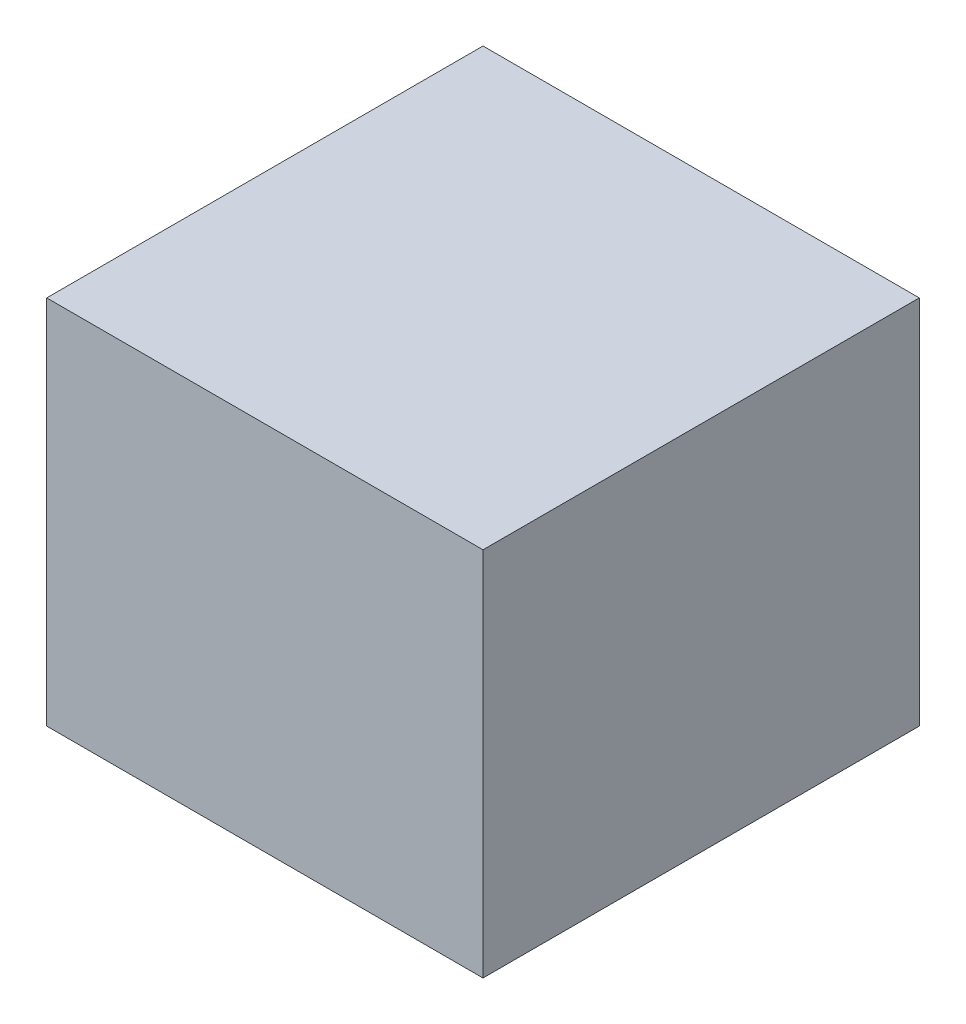
ISO-10303-21;
HEADER;
FILE_DESCRIPTION(('STEP AP214'),'2;1');
FILE_NAME('part.step','',(''),(''),'','','');
FILE_SCHEMA(('AUTOMOTIVE_DESIGN { 1 0 10303 214 1 1 1 1 }'));
ENDSEC;
DATA;
#1=APPLICATION_CONTEXT('core data for automotive mechanical design processes');
#2=APPLICATION_PROTOCOL_DEFINITION('international standard','automotive_design',2000,#1);
#3=PRODUCT_CONTEXT('',#1,'mechanical');
#4=PRODUCT('Part','Part','',(#3));
#5=PRODUCT_RELATED_PRODUCT_CATEGORY('part','',(#4));
#6=PRODUCT_DEFINITION_FORMATION('','',#4);
#7=PRODUCT_DEFINITION_CONTEXT('part definition',#1,'design');
#8=PRODUCT_DEFINITION('design','',#6,#7);
#9=PRODUCT_DEFINITION_SHAPE('','',#8);
#10=(LENGTH_UNIT() NAMED_UNIT(*) SI_UNIT(.MILLI.,.METRE.));
#11=(NAMED_UNIT(*) PLANE_ANGLE_UNIT() SI_UNIT($,.RADIAN.));
#12=(NAMED_UNIT(*) SI_UNIT($,.STERADIAN.) SOLID_ANGLE_UNIT());
#13=UNCERTAINTY_MEASURE_WITH_UNIT(LENGTH_MEASURE(1.E-05),#10,'distance_accuracy_value','');
#14=(GEOMETRIC_REPRESENTATION_CONTEXT(3) GLOBAL_UNCERTAINTY_ASSIGNED_CONTEXT((#13)) GLOBAL_UNIT_ASSIGNED_CONTEXT((#10,
#11,#12)) REPRESENTATION_CONTEXT('',''));
#15=CARTESIAN_POINT('',(0.,0.,0.));
#16=DIRECTION('',(0.,0.,1.));
#17=DIRECTION('',(1.,0.,0.));
#18=AXIS2_PLACEMENT_3D('',#15,#16,#17);
#19=CARTESIAN_POINT('',(0.,76.2,0.));
#20=DIRECTION('',(0.,1.,0.));
#21=DIRECTION('',(0.,0.,1.));
#22=AXIS2_PLACEMENT_3D('',#19,#20,#21);
#23=PLANE('',#22);
#24=CARTESIAN_POINT('',(0.,76.2,0.));
#25=DIRECTION('',(0.,1.,0.));
#26=DIRECTION('',(0.,0.,1.));
#27=AXIS2_PLACEMENT_3D('',#24,#25,#26);
#28=CIRCLE('',#27,10.16);
#29=CARTESIAN_POINT('',(0.,76.2,10.16));
#30=VERTEX_POINT('',#29);
#31=EDGE_CURVE('E176',#30,#30,#28,.T.);
#32=ORIENTED_EDGE('',*,*,#31,.F.);
#33=EDGE_LOOP('',(#32));
#34=FACE_BOUND('',#33,.T.);
#35=ADVANCED_FACE('F39',(#34),#23,.F.);
#36=CARTESIAN_POINT('',(13.208,86.36,0.));
#37=DIRECTION('',(0.,-1.,0.));
#38=DIRECTION('',(0.,0.,-1.));
#39=AXIS2_PLACEMENT_3D('',#36,#37,#38);
#40=PLANE('',#39);
#41=DIRECTION('',(0.,0.,-1.));
#42=VECTOR('',#41,1.);
#43=CARTESIAN_POINT('',(50.8,86.36,50.8));
#44=LINE('',#43,#42);
#45=CARTESIAN_POINT('',(50.8,86.36,50.8));
#46=VERTEX_POINT('',#45);
#47=CARTESIAN_POINT('',(50.8,86.36,-50.8));
#48=VERTEX_POINT('',#47);
#49=EDGE_CURVE('E47',#46,#48,#44,.T.);
#50=ORIENTED_EDGE('',*,*,#49,.T.);
#51=DIRECTION('',(-1.,0.,0.));
#52=VECTOR('',#51,1.);
#53=CARTESIAN_POINT('',(-50.8,86.36,-50.8));
#54=LINE('',#53,#52);
#55=CARTESIAN_POINT('',(-50.8,86.36,-50.8));
#56=VERTEX_POINT('',#55);
#57=EDGE_CURVE('E53',#48,#56,#54,.T.);
#58=ORIENTED_EDGE('',*,*,#57,.T.);
#59=DIRECTION('',(0.,0.,1.));
#60=VECTOR('',#59,1.);
#61=CARTESIAN_POINT('',(-50.8,86.36,50.8));
#62=LINE('',#61,#60);
#63=CARTESIAN_POINT('',(-50.8,86.36,50.8));
#64=VERTEX_POINT('',#63);
#65=EDGE_CURVE('E109',#56,#64,#62,.T.);
#66=ORIENTED_EDGE('',*,*,#65,.T.);
#67=DIRECTION('',(1.,0.,0.));
#68=VECTOR('',#67,1.);
#69=CARTESIAN_POINT('',(-50.8,86.36,50.8));
#70=LINE('',#69,#68);
#71=EDGE_CURVE('E11',#64,#46,#70,.T.);
#72=ORIENTED_EDGE('',*,*,#71,.T.);
#73=EDGE_LOOP('',(#50,#58,#66,#72));
#74=FACE_BOUND('',#73,.T.);
#75=ADVANCED_FACE('F187',(#74),#40,.F.);
#76=CARTESIAN_POINT('',(-50.8,240.204097937106,-50.8));
#77=DIRECTION('',(0.,0.,-1.));
#78=DIRECTION('',(-1.,0.,0.));
#79=AXIS2_PLACEMENT_3D('',#76,#77,#78);
#80=PLANE('',#79);
#81=ORIENTED_EDGE('',*,*,#57,.F.);
#82=DIRECTION('',(0.,-1.,0.));
#83=VECTOR('',#82,1.);
#84=CARTESIAN_POINT('',(50.8,240.204097937106,-50.8));
#85=LINE('',#84,#83);
#86=CARTESIAN_POINT('',(50.8,0.,-50.8));
#87=VERTEX_POINT('',#86);
#88=EDGE_CURVE('E107',#48,#87,#85,.T.);
#89=ORIENTED_EDGE('',*,*,#88,.T.);
#90=DIRECTION('',(1.,0.,0.));
#91=VECTOR('',#90,1.);
#92=CARTESIAN_POINT('',(-50.8,0.,-50.8));
#93=LINE('',#92,#91);
#94=CARTESIAN_POINT('',(-50.8,0.,-50.8));
#95=VERTEX_POINT('',#94);
#96=EDGE_CURVE('E85',#95,#87,#93,.T.);
#97=ORIENTED_EDGE('',*,*,#96,.F.);
#98=DIRECTION('',(0.,-1.,0.));
#99=VECTOR('',#98,1.);
#100=CARTESIAN_POINT('',(-50.8,240.204097937106,-50.8));
#101=LINE('',#100,#99);
#102=EDGE_CURVE('E110',#56,#95,#101,.T.);
#103=ORIENTED_EDGE('',*,*,#102,.F.);
#104=EDGE_LOOP('',(#81,#89,#97,#103));
#105=FACE_BOUND('',#104,.T.);
#106=ADVANCED_FACE('F116',(#105),#80,.T.);
#107=CARTESIAN_POINT('',(-50.8,240.204097937106,50.8));
#108=DIRECTION('',(-1.,0.,0.));
#109=DIRECTION('',(0.,0.,1.));
#110=AXIS2_PLACEMENT_3D('',#107,#108,#109);
#111=PLANE('',#110);
#112=ORIENTED_EDGE('',*,*,#65,.F.);
#113=ORIENTED_EDGE('',*,*,#102,.T.);
#114=DIRECTION('',(0.,0.,-1.));
#115=VECTOR('',#114,1.);
#116=CARTESIAN_POINT('',(-50.8,0.,50.8));
#117=LINE('',#116,#115);
#118=CARTESIAN_POINT('',(-50.8,0.,50.8));
#119=VERTEX_POINT('',#118);
#120=EDGE_CURVE('E93',#119,#95,#117,.T.);
#121=ORIENTED_EDGE('',*,*,#120,.F.);
#122=DIRECTION('',(0.,-1.,0.));
#123=VECTOR('',#122,1.);
#124=CARTESIAN_POINT('',(-50.8,240.204097937106,50.8));
#125=LINE('',#124,#123);
#126=EDGE_CURVE('E84',#64,#119,#125,.T.);
#127=ORIENTED_EDGE('',*,*,#126,.F.);
#128=EDGE_LOOP('',(#112,#113,#121,#127));
#129=FACE_BOUND('',#128,.T.);
#130=ADVANCED_FACE('F114',(#129),#111,.T.);
#131=CARTESIAN_POINT('',(-50.8,240.204097937106,50.8));
#132=DIRECTION('',(0.,0.,1.));
#133=DIRECTION('',(1.,0.,0.));
#134=AXIS2_PLACEMENT_3D('',#131,#132,#133);
#135=PLANE('',#134);
#136=ORIENTED_EDGE('',*,*,#71,.F.);
#137=ORIENTED_EDGE('',*,*,#126,.T.);
#138=DIRECTION('',(-1.,0.,0.));
#139=VECTOR('',#138,1.);
#140=CARTESIAN_POINT('',(-50.8,0.,50.8));
#141=LINE('',#140,#139);
#142=CARTESIAN_POINT('',(50.8,0.,50.8));
#143=VERTEX_POINT('',#142);
#144=EDGE_CURVE('E87',#143,#119,#141,.T.);
#145=ORIENTED_EDGE('',*,*,#144,.F.);
#146=DIRECTION('',(0.,-1.,0.));
#147=VECTOR('',#146,1.);
#148=CARTESIAN_POINT('',(50.8,240.204097937106,50.8));
#149=LINE('',#148,#147);
#150=EDGE_CURVE('E75',#46,#143,#149,.T.);
#151=ORIENTED_EDGE('',*,*,#150,.F.);
#152=EDGE_LOOP('',(#136,#137,#145,#151));
#153=FACE_BOUND('',#152,.T.);
#154=ADVANCED_FACE('F88',(#153),#135,.T.);
#155=CARTESIAN_POINT('',(50.8,240.204097937106,50.8));
#156=DIRECTION('',(1.,0.,0.));
#157=DIRECTION('',(0.,0.,-1.));
#158=AXIS2_PLACEMENT_3D('',#155,#156,#157);
#159=PLANE('',#158);
#160=ORIENTED_EDGE('',*,*,#49,.F.);
#161=ORIENTED_EDGE('',*,*,#150,.T.);
#162=DIRECTION('',(0.,0.,1.));
#163=VECTOR('',#162,1.);
#164=CARTESIAN_POINT('',(50.8,0.,50.8));
#165=LINE('',#164,#163);
#166=EDGE_CURVE('E80',#87,#143,#165,.T.);
#167=ORIENTED_EDGE('',*,*,#166,.F.);
#168=ORIENTED_EDGE('',*,*,#88,.F.);
#169=EDGE_LOOP('',(#160,#161,#167,#168));
#170=FACE_BOUND('',#169,.T.);
#171=ADVANCED_FACE('F77',(#170),#159,.T.);
#172=CARTESIAN_POINT('',(0.,0.,0.));
#173=DIRECTION('',(0.,-1.,0.));
#174=DIRECTION('',(0.,0.,-1.));
#175=AXIS2_PLACEMENT_3D('',#172,#173,#174);
#176=PLANE('',#175);
#177=CARTESIAN_POINT('',(0.,0.,0.));
#178=DIRECTION('',(0.,1.,0.));
#179=DIRECTION('',(0.,0.,1.));
#180=AXIS2_PLACEMENT_3D('',#177,#178,#179);
#181=CIRCLE('',#180,35.56);
#182=CARTESIAN_POINT('',(0.,0.,35.56));
#183=VERTEX_POINT('',#182);
#184=EDGE_CURVE('E145',#183,#183,#181,.F.);
#185=ORIENTED_EDGE('',*,*,#184,.F.);
#186=EDGE_LOOP('',(#185));
#187=FACE_BOUND('',#186,.T.);
#188=ORIENTED_EDGE('',*,*,#166,.T.);
#189=ORIENTED_EDGE('',*,*,#144,.T.);
#190=ORIENTED_EDGE('',*,*,#120,.T.);
#191=ORIENTED_EDGE('',*,*,#96,.T.);
#192=EDGE_LOOP('',(#188,#189,#190,#191));
#193=FACE_BOUND('',#192,.T.);
#194=ADVANCED_FACE('F95',(#187,#193),#176,.T.);
#195=CARTESIAN_POINT('',(0.,60.6579363383213,0.));
#196=DIRECTION('',(0.,1.,0.));
#197=DIRECTION('',(0.,0.,1.));
#198=AXIS2_PLACEMENT_3D('',#195,#196,#197);
#199=TOROIDAL_SURFACE('',#198,23.368,10.16);
#200=CARTESIAN_POINT('',(0.,60.6579363383213,0.));
#201=DIRECTION('',(0.,1.,0.));
#202=DIRECTION('',(0.,0.,1.));
#203=AXIS2_PLACEMENT_3D('',#200,#201,#202);
#204=CIRCLE('',#203,13.208);
#205=CARTESIAN_POINT('',(0.,60.6579363383213,13.208));
#206=VERTEX_POINT('',#205);
#207=EDGE_CURVE('E167',#206,#206,#204,.T.);
#208=ORIENTED_EDGE('',*,*,#207,.T.);
#209=EDGE_LOOP('',(#208));
#210=FACE_BOUND('',#209,.T.);
#211=CARTESIAN_POINT('',(0.,54.3893477857335,0.));
#212=DIRECTION('',(0.,1.,0.));
#213=DIRECTION('',(0.,0.,1.));
#214=AXIS2_PLACEMENT_3D('',#211,#212,#213);
#215=CIRCLE('',#214,15.372351335985);
#216=CARTESIAN_POINT('',(0.,54.3893477857335,15.372351335985));
#217=VERTEX_POINT('',#216);
#218=EDGE_CURVE('E164',#217,#217,#215,.T.);
#219=ORIENTED_EDGE('',*,*,#218,.F.);
#220=EDGE_LOOP('',(#219));
#221=FACE_BOUND('',#220,.T.);
#222=ADVANCED_FACE('F194',(#210,#221),#199,.T.);
#223=CARTESIAN_POINT('',(0.,76.2,0.));
#224=DIRECTION('',(0.,1.,0.));
#225=DIRECTION('',(0.,0.,1.));
#226=AXIS2_PLACEMENT_3D('',#223,#224,#225);
#227=CYLINDRICAL_SURFACE('',#226,13.208);
#228=CARTESIAN_POINT('',(0.,64.2062181691606,0.));
#229=DIRECTION('',(0.,-1.,0.));
#230=DIRECTION('',(0.,0.,-1.));
#231=AXIS2_PLACEMENT_3D('',#228,#229,#230);
#232=CIRCLE('',#231,13.208);
#233=CARTESIAN_POINT('',(0.,64.2062181691606,-13.208));
#234=VERTEX_POINT('',#233);
#235=EDGE_CURVE('E127',#234,#234,#232,.T.);
#236=ORIENTED_EDGE('',*,*,#235,.F.);
#237=EDGE_LOOP('',(#236));
#238=FACE_BOUND('',#237,.T.);
#239=ORIENTED_EDGE('',*,*,#207,.F.);
#240=EDGE_LOOP('',(#239));
#241=FACE_BOUND('',#240,.T.);
#242=ADVANCED_FACE('F201',(#238,#241),#227,.F.);
#243=CARTESIAN_POINT('',(0.,64.2062181691606,0.));
#244=DIRECTION('',(0.,-1.,0.));
#245=DIRECTION('',(0.,0.,-1.));
#246=AXIS2_PLACEMENT_3D('',#243,#244,#245);
#247=TOROIDAL_SURFACE('',#246,12.954,0.254);
#248=ORIENTED_EDGE('',*,*,#235,.T.);
#249=EDGE_LOOP('',(#248));
#250=FACE_BOUND('',#249,.T.);
#251=CARTESIAN_POINT('',(0.,64.4602181691606,0.));
#252=DIRECTION('',(0.,-1.,0.));
#253=DIRECTION('',(0.,0.,-1.));
#254=AXIS2_PLACEMENT_3D('',#251,#252,#253);
#255=CIRCLE('',#254,12.954);
#256=CARTESIAN_POINT('',(0.,64.4602181691606,-12.954));
#257=VERTEX_POINT('',#256);
#258=EDGE_CURVE('E130',#257,#257,#255,.F.);
#259=ORIENTED_EDGE('',*,*,#258,.T.);
#260=EDGE_LOOP('',(#259));
#261=FACE_BOUND('',#260,.T.);
#262=ADVANCED_FACE('F248',(#250,#261),#247,.F.);
#263=CARTESIAN_POINT('',(12.446,64.4602181691606,0.));
#264=DIRECTION('',(0.,-1.,0.));
#265=DIRECTION('',(0.,0.,-1.));
#266=AXIS2_PLACEMENT_3D('',#263,#264,#265);
#267=PLANE('',#266);
#268=ORIENTED_EDGE('',*,*,#258,.F.);
#269=EDGE_LOOP('',(#268));
#270=FACE_BOUND('',#269,.T.);
#271=CARTESIAN_POINT('',(0.,64.4602181691606,0.));
#272=DIRECTION('',(0.,1.,0.));
#273=DIRECTION('',(0.,0.,1.));
#274=AXIS2_PLACEMENT_3D('',#271,#272,#273);
#275=CIRCLE('',#274,12.446);
#276=CARTESIAN_POINT('',(0.,64.4602181691606,12.446));
#277=VERTEX_POINT('',#276);
#278=EDGE_CURVE('E170',#277,#277,#275,.T.);
#279=ORIENTED_EDGE('',*,*,#278,.T.);
#280=EDGE_LOOP('',(#279));
#281=FACE_BOUND('',#280,.T.);
#282=ADVANCED_FACE('F261',(#270,#281),#267,.T.);
#283=CARTESIAN_POINT('',(0.,76.2,0.));
#284=DIRECTION('',(0.,1.,0.));
#285=DIRECTION('',(0.,0.,1.));
#286=AXIS2_PLACEMENT_3D('',#283,#284,#285);
#287=CYLINDRICAL_SURFACE('',#286,12.446);
#288=CARTESIAN_POINT('',(0.,72.3977181691606,0.));
#289=DIRECTION('',(0.,1.,0.));
#290=DIRECTION('',(0.,0.,1.));
#291=AXIS2_PLACEMENT_3D('',#288,#289,#290);
#292=CIRCLE('',#291,12.446);
#293=CARTESIAN_POINT('',(0.,72.3977181691606,12.446));
#294=VERTEX_POINT('',#293);
#295=EDGE_CURVE('E173',#294,#294,#292,.T.);
#296=ORIENTED_EDGE('',*,*,#295,.T.);
#297=EDGE_LOOP('',(#296));
#298=FACE_BOUND('',#297,.T.);
#299=ORIENTED_EDGE('',*,*,#278,.F.);
#300=EDGE_LOOP('',(#299));
#301=FACE_BOUND('',#300,.T.);
#302=ADVANCED_FACE('F274',(#298,#301),#287,.F.);
#303=CARTESIAN_POINT('',(13.208,72.3977181691606,0.));
#304=DIRECTION('',(0.,1.,0.));
#305=DIRECTION('',(0.,0.,1.));
#306=AXIS2_PLACEMENT_3D('',#303,#304,#305);
#307=PLANE('',#306);
#308=CARTESIAN_POINT('',(0.,72.3977181691606,0.));
#309=DIRECTION('',(0.,1.,0.));
#310=DIRECTION('',(0.,0.,1.));
#311=AXIS2_PLACEMENT_3D('',#308,#309,#310);
#312=CIRCLE('',#311,12.954);
#313=CARTESIAN_POINT('',(0.,72.3977181691606,12.954));
#314=VERTEX_POINT('',#313);
#315=EDGE_CURVE('E133',#314,#314,#312,.F.);
#316=ORIENTED_EDGE('',*,*,#315,.F.);
#317=EDGE_LOOP('',(#316));
#318=FACE_BOUND('',#317,.T.);
#319=ORIENTED_EDGE('',*,*,#295,.F.);
#320=EDGE_LOOP('',(#319));
#321=FACE_BOUND('',#320,.T.);
#322=ADVANCED_FACE('F286',(#318,#321),#307,.T.);
#323=CARTESIAN_POINT('',(0.,72.6517181691606,0.));
#324=DIRECTION('',(0.,1.,0.));
#325=DIRECTION('',(0.,0.,1.));
#326=AXIS2_PLACEMENT_3D('',#323,#324,#325);
#327=TOROIDAL_SURFACE('',#326,12.954,0.254);
#328=ORIENTED_EDGE('',*,*,#315,.T.);
#329=EDGE_LOOP('',(#328));
#330=FACE_BOUND('',#329,.T.);
#331=CARTESIAN_POINT('',(0.,72.6517181691606,0.));
#332=DIRECTION('',(0.,1.,0.));
#333=DIRECTION('',(0.,0.,1.));
#334=AXIS2_PLACEMENT_3D('',#331,#332,#333);
#335=CIRCLE('',#334,13.208);
#336=CARTESIAN_POINT('',(0.,72.6517181691606,13.208));
#337=VERTEX_POINT('',#336);
#338=EDGE_CURVE('E136',#337,#337,#335,.T.);
#339=ORIENTED_EDGE('',*,*,#338,.T.);
#340=EDGE_LOOP('',(#339));
#341=FACE_BOUND('',#340,.T.);
#342=ADVANCED_FACE('F297',(#330,#341),#327,.F.);
#343=CARTESIAN_POINT('',(0.,76.2,0.));
#344=DIRECTION('',(0.,1.,0.));
#345=DIRECTION('',(0.,0.,1.));
#346=AXIS2_PLACEMENT_3D('',#343,#344,#345);
#347=CYLINDRICAL_SURFACE('',#346,13.208);
#348=ORIENTED_EDGE('',*,*,#338,.F.);
#349=EDGE_LOOP('',(#348));
#350=FACE_BOUND('',#349,.T.);
#351=CARTESIAN_POINT('',(0.,73.66,0.));
#352=DIRECTION('',(0.,-1.,0.));
#353=DIRECTION('',(0.,0.,-1.));
#354=AXIS2_PLACEMENT_3D('',#351,#352,#353);
#355=CIRCLE('',#354,13.208);
#356=CARTESIAN_POINT('',(0.,73.66,-13.208));
#357=VERTEX_POINT('',#356);
#358=EDGE_CURVE('E139',#357,#357,#355,.T.);
#359=ORIENTED_EDGE('',*,*,#358,.F.);
#360=EDGE_LOOP('',(#359));
#361=FACE_BOUND('',#360,.T.);
#362=ADVANCED_FACE('F307',(#350,#361),#347,.F.);
#363=CARTESIAN_POINT('',(0.,73.66,0.));
#364=DIRECTION('',(0.,-1.,0.));
#365=DIRECTION('',(0.,0.,-1.));
#366=AXIS2_PLACEMENT_3D('',#363,#364,#365);
#367=TOROIDAL_SURFACE('',#366,10.668,2.54);
#368=ORIENTED_EDGE('',*,*,#358,.T.);
#369=EDGE_LOOP('',(#368));
#370=FACE_BOUND('',#369,.T.);
#371=CARTESIAN_POINT('',(0.,76.2,0.));
#372=DIRECTION('',(0.,-1.,0.));
#373=DIRECTION('',(0.,0.,-1.));
#374=AXIS2_PLACEMENT_3D('',#371,#372,#373);
#375=CIRCLE('',#374,10.668);
#376=CARTESIAN_POINT('',(0.,76.2,-10.668));
#377=VERTEX_POINT('',#376);
#378=EDGE_CURVE('E142',#377,#377,#375,.F.);
#379=ORIENTED_EDGE('',*,*,#378,.T.);
#380=EDGE_LOOP('',(#379));
#381=FACE_BOUND('',#380,.T.);
#382=ADVANCED_FACE('F318',(#370,#381),#367,.F.);
#383=CARTESIAN_POINT('',(13.208,76.2,0.));
#384=DIRECTION('',(0.,-1.,0.));
#385=DIRECTION('',(0.,0.,-1.));
#386=AXIS2_PLACEMENT_3D('',#383,#384,#385);
#387=PLANE('',#386);
#388=ORIENTED_EDGE('',*,*,#378,.F.);
#389=EDGE_LOOP('',(#388));
#390=FACE_BOUND('',#389,.T.);
#391=ORIENTED_EDGE('',*,*,#31,.T.);
#392=EDGE_LOOP('',(#391));
#393=FACE_BOUND('',#392,.T.);
#394=ADVANCED_FACE('F184',(#390,#393),#387,.T.);
#395=CARTESIAN_POINT('',(0.,28.1606522142665,0.));
#396=DIRECTION('',(0.,-1.,0.));
#397=DIRECTION('',(0.,0.,-1.));
#398=AXIS2_PLACEMENT_3D('',#395,#396,#397);
#399=CONICAL_SURFACE('',#398,35.935648664015,0.664908417409286);
#400=ORIENTED_EDGE('',*,*,#218,.T.);
#401=EDGE_LOOP('',(#400));
#402=FACE_BOUND('',#401,.T.);
#403=CARTESIAN_POINT('',(0.,28.1606522142665,0.));
#404=DIRECTION('',(0.,1.,0.));
#405=DIRECTION('',(0.,0.,1.));
#406=AXIS2_PLACEMENT_3D('',#403,#404,#405);
#407=CIRCLE('',#406,35.935648664015);
#408=CARTESIAN_POINT('',(0.,28.1606522142665,35.935648664015));
#409=VERTEX_POINT('',#408);
#410=EDGE_CURVE('E161',#409,#409,#407,.T.);
#411=ORIENTED_EDGE('',*,*,#410,.F.);
#412=EDGE_LOOP('',(#411));
#413=FACE_BOUND('',#412,.T.);
#414=ADVANCED_FACE('F341',(#402,#413),#399,.F.);
#415=CARTESIAN_POINT('',(0.,21.8920636616788,0.));
#416=DIRECTION('',(0.,1.,0.));
#417=DIRECTION('',(0.,0.,1.));
#418=AXIS2_PLACEMENT_3D('',#415,#416,#417);
#419=TOROIDAL_SURFACE('',#418,27.94,10.16);
#420=ORIENTED_EDGE('',*,*,#410,.T.);
#421=EDGE_LOOP('',(#420));
#422=FACE_BOUND('',#421,.T.);
#423=CARTESIAN_POINT('',(0.,21.8920636616788,0.));
#424=DIRECTION('',(0.,1.,0.));
#425=DIRECTION('',(0.,0.,1.));
#426=AXIS2_PLACEMENT_3D('',#423,#424,#425);
#427=CIRCLE('',#426,38.1);
#428=CARTESIAN_POINT('',(0.,21.8920636616788,38.1));
#429=VERTEX_POINT('',#428);
#430=EDGE_CURVE('E158',#429,#429,#427,.T.);
#431=ORIENTED_EDGE('',*,*,#430,.F.);
#432=EDGE_LOOP('',(#431));
#433=FACE_BOUND('',#432,.T.);
#434=ADVANCED_FACE('F354',(#422,#433),#419,.F.);
#435=CARTESIAN_POINT('',(0.,76.2,0.));
#436=DIRECTION('',(0.,1.,0.));
#437=DIRECTION('',(0.,0.,1.));
#438=AXIS2_PLACEMENT_3D('',#435,#436,#437);
#439=CYLINDRICAL_SURFACE('',#438,38.1);
#440=CARTESIAN_POINT('',(0.,15.1687818308394,0.));
#441=DIRECTION('',(0.,1.,0.));
#442=DIRECTION('',(0.,0.,1.));
#443=AXIS2_PLACEMENT_3D('',#440,#441,#442);
#444=CIRCLE('',#443,38.1);
#445=CARTESIAN_POINT('',(0.,15.1687818308394,38.1));
#446=VERTEX_POINT('',#445);
#447=EDGE_CURVE('E124',#446,#446,#444,.T.);
#448=ORIENTED_EDGE('',*,*,#447,.F.);
#449=EDGE_LOOP('',(#448));
#450=FACE_BOUND('',#449,.T.);
#451=ORIENTED_EDGE('',*,*,#430,.T.);
#452=EDGE_LOOP('',(#451));
#453=FACE_BOUND('',#452,.T.);
#454=ADVANCED_FACE('F364',(#450,#453),#439,.F.);
#455=CARTESIAN_POINT('',(0.,15.1687818308394,0.));
#456=DIRECTION('',(0.,1.,0.));
#457=DIRECTION('',(0.,0.,1.));
#458=AXIS2_PLACEMENT_3D('',#455,#456,#457);
#459=TOROIDAL_SURFACE('',#458,37.846,0.254);
#460=CARTESIAN_POINT('',(0.,14.9147818308394,0.));
#461=DIRECTION('',(0.,1.,0.));
#462=DIRECTION('',(0.,0.,1.));
#463=AXIS2_PLACEMENT_3D('',#460,#461,#462);
#464=CIRCLE('',#463,37.846);
#465=CARTESIAN_POINT('',(0.,14.9147818308394,37.846));
#466=VERTEX_POINT('',#465);
#467=EDGE_CURVE('E121',#466,#466,#464,.F.);
#468=ORIENTED_EDGE('',*,*,#467,.T.);
#469=EDGE_LOOP('',(#468));
#470=FACE_BOUND('',#469,.T.);
#471=ORIENTED_EDGE('',*,*,#447,.T.);
#472=EDGE_LOOP('',(#471));
#473=FACE_BOUND('',#472,.T.);
#474=ADVANCED_FACE('F374',(#470,#473),#459,.F.);
#475=CARTESIAN_POINT('',(38.1,14.9147818308394,0.));
#476=DIRECTION('',(0.,1.,0.));
#477=DIRECTION('',(0.,0.,1.));
#478=AXIS2_PLACEMENT_3D('',#475,#476,#477);
#479=PLANE('',#478);
#480=ORIENTED_EDGE('',*,*,#467,.F.);
#481=EDGE_LOOP('',(#480));
#482=FACE_BOUND('',#481,.T.);
#483=CARTESIAN_POINT('',(0.,14.9147818308394,0.));
#484=DIRECTION('',(0.,1.,0.));
#485=DIRECTION('',(0.,0.,1.));
#486=AXIS2_PLACEMENT_3D('',#483,#484,#485);
#487=CIRCLE('',#486,37.338);
#488=CARTESIAN_POINT('',(0.,14.9147818308394,37.338));
#489=VERTEX_POINT('',#488);
#490=EDGE_CURVE('E155',#489,#489,#487,.T.);
#491=ORIENTED_EDGE('',*,*,#490,.F.);
#492=EDGE_LOOP('',(#491));
#493=FACE_BOUND('',#492,.T.);
#494=ADVANCED_FACE('F385',(#482,#493),#479,.T.);
#495=CARTESIAN_POINT('',(0.,76.2,0.));
#496=DIRECTION('',(0.,1.,0.));
#497=DIRECTION('',(0.,0.,1.));
#498=AXIS2_PLACEMENT_3D('',#495,#496,#497);
#499=CYLINDRICAL_SURFACE('',#498,37.338);
#500=ORIENTED_EDGE('',*,*,#490,.T.);
#501=EDGE_LOOP('',(#500));
#502=FACE_BOUND('',#501,.T.);
#503=CARTESIAN_POINT('',(0.,6.97728183083939,0.));
#504=DIRECTION('',(0.,1.,0.));
#505=DIRECTION('',(0.,0.,1.));
#506=AXIS2_PLACEMENT_3D('',#503,#504,#505);
#507=CIRCLE('',#506,37.338);
#508=CARTESIAN_POINT('',(0.,6.97728183083939,37.338));
#509=VERTEX_POINT('',#508);
#510=EDGE_CURVE('E152',#509,#509,#507,.T.);
#511=ORIENTED_EDGE('',*,*,#510,.F.);
#512=EDGE_LOOP('',(#511));
#513=FACE_BOUND('',#512,.T.);
#514=ADVANCED_FACE('F395',(#502,#513),#499,.F.);
#515=CARTESIAN_POINT('',(37.338,6.97728183083938,0.));
#516=DIRECTION('',(0.,-1.,0.));
#517=DIRECTION('',(0.,0.,-1.));
#518=AXIS2_PLACEMENT_3D('',#515,#516,#517);
#519=PLANE('',#518);
#520=CARTESIAN_POINT('',(0.,6.97728183083938,0.));
#521=DIRECTION('',(0.,-1.,0.));
#522=DIRECTION('',(0.,0.,-1.));
#523=AXIS2_PLACEMENT_3D('',#520,#521,#522);
#524=CIRCLE('',#523,37.846);
#525=CARTESIAN_POINT('',(0.,6.97728183083938,-37.846));
#526=VERTEX_POINT('',#525);
#527=EDGE_CURVE('E100',#526,#526,#524,.F.);
#528=ORIENTED_EDGE('',*,*,#527,.F.);
#529=EDGE_LOOP('',(#528));
#530=FACE_BOUND('',#529,.T.);
#531=ORIENTED_EDGE('',*,*,#510,.T.);
#532=EDGE_LOOP('',(#531));
#533=FACE_BOUND('',#532,.T.);
#534=ADVANCED_FACE('F406',(#530,#533),#519,.T.);
#535=CARTESIAN_POINT('',(0.,6.72328183083938,0.));
#536=DIRECTION('',(0.,-1.,0.));
#537=DIRECTION('',(0.,0.,-1.));
#538=AXIS2_PLACEMENT_3D('',#535,#536,#537);
#539=TOROIDAL_SURFACE('',#538,37.846,0.254);
#540=CARTESIAN_POINT('',(0.,6.72328183083938,0.));
#541=DIRECTION('',(0.,-1.,0.));
#542=DIRECTION('',(0.,0.,-1.));
#543=AXIS2_PLACEMENT_3D('',#540,#541,#542);
#544=CIRCLE('',#543,38.1);
#545=CARTESIAN_POINT('',(0.,6.72328183083938,-38.1));
#546=VERTEX_POINT('',#545);
#547=EDGE_CURVE('E97',#546,#546,#544,.T.);
#548=ORIENTED_EDGE('',*,*,#547,.T.);
#549=EDGE_LOOP('',(#548));
#550=FACE_BOUND('',#549,.T.);
#551=ORIENTED_EDGE('',*,*,#527,.T.);
#552=EDGE_LOOP('',(#551));
#553=FACE_BOUND('',#552,.T.);
#554=ADVANCED_FACE('F417',(#550,#553),#539,.F.);
#555=CARTESIAN_POINT('',(0.,76.2,0.));
#556=DIRECTION('',(0.,1.,0.));
#557=DIRECTION('',(0.,0.,1.));
#558=AXIS2_PLACEMENT_3D('',#555,#556,#557);
#559=CYLINDRICAL_SURFACE('',#558,38.1);
#560=ORIENTED_EDGE('',*,*,#547,.F.);
#561=EDGE_LOOP('',(#560));
#562=FACE_BOUND('',#561,.T.);
#563=CARTESIAN_POINT('',(0.,2.54,0.));
#564=DIRECTION('',(0.,1.,0.));
#565=DIRECTION('',(0.,0.,1.));
#566=AXIS2_PLACEMENT_3D('',#563,#564,#565);
#567=CIRCLE('',#566,38.1);
#568=CARTESIAN_POINT('',(0.,2.54,38.1));
#569=VERTEX_POINT('',#568);
#570=EDGE_CURVE('E149',#569,#569,#567,.T.);
#571=ORIENTED_EDGE('',*,*,#570,.F.);
#572=EDGE_LOOP('',(#571));
#573=FACE_BOUND('',#572,.T.);
#574=ADVANCED_FACE('F427',(#562,#573),#559,.F.);
#575=CARTESIAN_POINT('',(0.,2.54,0.));
#576=DIRECTION('',(0.,1.,0.));
#577=DIRECTION('',(0.,0.,1.));
#578=AXIS2_PLACEMENT_3D('',#575,#576,#577);
#579=TOROIDAL_SURFACE('',#578,35.56,2.54);
#580=ORIENTED_EDGE('',*,*,#184,.T.);
#581=EDGE_LOOP('',(#580));
#582=FACE_BOUND('',#581,.T.);
#583=ORIENTED_EDGE('',*,*,#570,.T.);
#584=EDGE_LOOP('',(#583));
#585=FACE_BOUND('',#584,.T.);
#586=ADVANCED_FACE('F192',(#582,#585),#579,.F.);
#587=CLOSED_SHELL('',(#35,#75,#106,#130,#154,#171,#194,#222,#242,#262,#282,#302,#322,#342,#362,
#382,#394,#414,#434,#454,#474,#494,#514,#534,#554,#574,#586));
#588=MANIFOLD_SOLID_BREP('B2',#587);
#589=ADVANCED_BREP_SHAPE_REPRESENTATION('',(#18,#588),#14);
#590=SHAPE_DEFINITION_REPRESENTATION(#9,#589);
ENDSEC;
END-ISO-10303-21;
